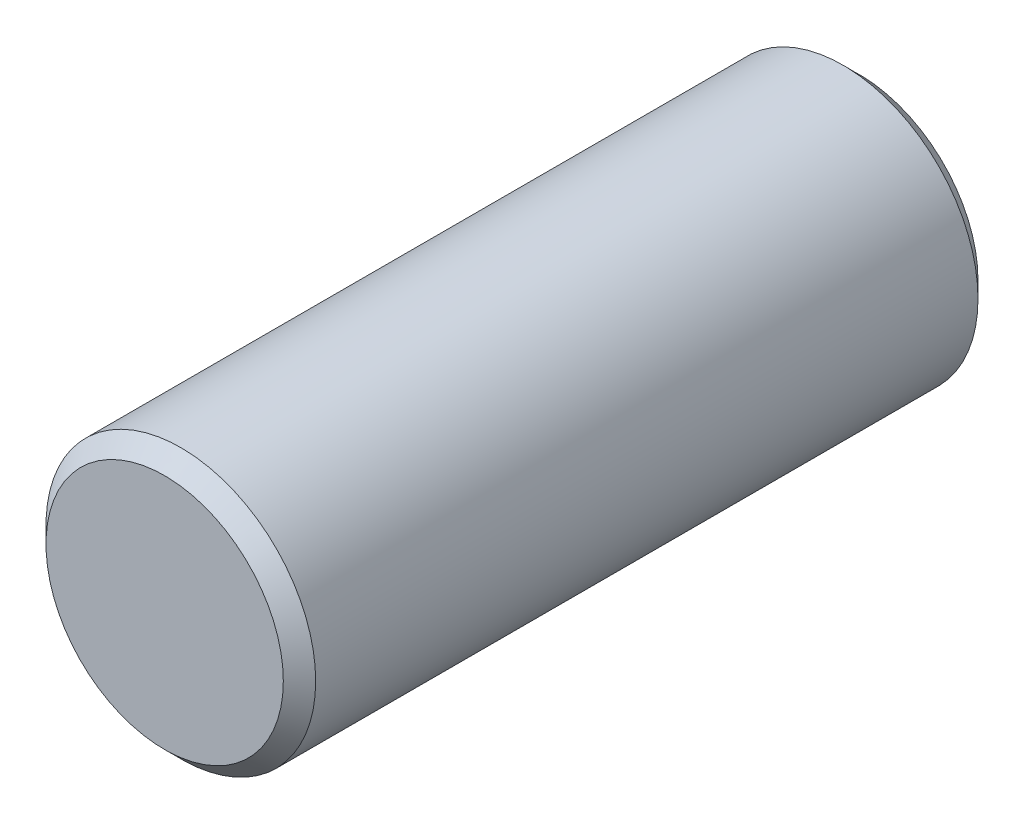
ISO-10303-21;
HEADER;
FILE_DESCRIPTION(('STEP AP214'),'2;1');
FILE_NAME('part.step','',(''),(''),'','','');
FILE_SCHEMA(('AUTOMOTIVE_DESIGN { 1 0 10303 214 1 1 1 1 }'));
ENDSEC;
DATA;
#1=APPLICATION_CONTEXT('core data for automotive mechanical design processes');
#2=APPLICATION_PROTOCOL_DEFINITION('international standard','automotive_design',2000,#1);
#3=PRODUCT_CONTEXT('',#1,'mechanical');
#4=PRODUCT('Part','Part','',(#3));
#5=PRODUCT_RELATED_PRODUCT_CATEGORY('part','',(#4));
#6=PRODUCT_DEFINITION_FORMATION('','',#4);
#7=PRODUCT_DEFINITION_CONTEXT('part definition',#1,'design');
#8=PRODUCT_DEFINITION('design','',#6,#7);
#9=PRODUCT_DEFINITION_SHAPE('','',#8);
#10=(LENGTH_UNIT() NAMED_UNIT(*) SI_UNIT(.MILLI.,.METRE.));
#11=(NAMED_UNIT(*) PLANE_ANGLE_UNIT() SI_UNIT($,.RADIAN.));
#12=(NAMED_UNIT(*) SI_UNIT($,.STERADIAN.) SOLID_ANGLE_UNIT());
#13=UNCERTAINTY_MEASURE_WITH_UNIT(LENGTH_MEASURE(1.E-05),#10,'distance_accuracy_value','');
#14=(GEOMETRIC_REPRESENTATION_CONTEXT(3) GLOBAL_UNCERTAINTY_ASSIGNED_CONTEXT((#13)) GLOBAL_UNIT_ASSIGNED_CONTEXT((#10,
#11,#12)) REPRESENTATION_CONTEXT('',''));
#15=CARTESIAN_POINT('',(0.,0.,0.));
#16=DIRECTION('',(0.,0.,1.));
#17=DIRECTION('',(1.,0.,0.));
#18=AXIS2_PLACEMENT_3D('',#15,#16,#17);
#19=CARTESIAN_POINT('',(0.,0.,8.1788));
#20=DIRECTION('',(0.,0.,-1.));
#21=DIRECTION('',(-1.,0.,0.));
#22=AXIS2_PLACEMENT_3D('',#19,#20,#21);
#23=CYLINDRICAL_SURFACE('',#22,3.175);
#24=CARTESIAN_POINT('',(0.,0.,-7.7978));
#25=DIRECTION('',(0.,0.,1.));
#26=DIRECTION('',(1.,0.,0.));
#27=AXIS2_PLACEMENT_3D('',#24,#25,#26);
#28=CIRCLE('',#27,3.175);
#29=CARTESIAN_POINT('',(3.175,0.,-7.7978));
#30=VERTEX_POINT('',#29);
#31=EDGE_CURVE('E40',#30,#30,#28,.T.);
#32=ORIENTED_EDGE('',*,*,#31,.T.);
#33=EDGE_LOOP('',(#32));
#34=FACE_BOUND('',#33,.T.);
#35=CARTESIAN_POINT('',(0.,0.,7.79779999999999));
#36=DIRECTION('',(0.,0.,1.));
#37=DIRECTION('',(1.,0.,0.));
#38=AXIS2_PLACEMENT_3D('',#35,#36,#37);
#39=CIRCLE('',#38,3.175);
#40=CARTESIAN_POINT('',(3.175,0.,7.79779999999999));
#41=VERTEX_POINT('',#40);
#42=EDGE_CURVE('E44',#41,#41,#39,.F.);
#43=ORIENTED_EDGE('',*,*,#42,.T.);
#44=EDGE_LOOP('',(#43));
#45=FACE_BOUND('',#44,.T.);
#46=ADVANCED_FACE('F30',(#34,#45),#23,.T.);
#47=CARTESIAN_POINT('',(0.,0.,8.1788));
#48=DIRECTION('',(0.,0.,1.));
#49=DIRECTION('',(1.,0.,0.));
#50=AXIS2_PLACEMENT_3D('',#47,#48,#49);
#51=PLANE('',#50);
#52=CARTESIAN_POINT('',(0.,0.,8.1788));
#53=DIRECTION('',(0.,0.,1.));
#54=DIRECTION('',(1.,0.,0.));
#55=AXIS2_PLACEMENT_3D('',#52,#53,#54);
#56=CIRCLE('',#55,2.79399999999999);
#57=CARTESIAN_POINT('',(2.79399999999999,0.,8.1788));
#58=VERTEX_POINT('',#57);
#59=EDGE_CURVE('E10',#58,#58,#56,.T.);
#60=ORIENTED_EDGE('',*,*,#59,.T.);
#61=EDGE_LOOP('',(#60));
#62=FACE_BOUND('',#61,.T.);
#63=ADVANCED_FACE('F63',(#62),#51,.T.);
#64=CARTESIAN_POINT('',(0.,0.,-8.1788));
#65=DIRECTION('',(0.,0.,1.));
#66=DIRECTION('',(1.,0.,0.));
#67=AXIS2_PLACEMENT_3D('',#64,#65,#66);
#68=PLANE('',#67);
#69=CARTESIAN_POINT('',(0.,0.,-8.1788));
#70=DIRECTION('',(0.,0.,1.));
#71=DIRECTION('',(1.,0.,0.));
#72=AXIS2_PLACEMENT_3D('',#69,#70,#71);
#73=CIRCLE('',#72,2.794);
#74=CARTESIAN_POINT('',(2.794,0.,-8.1788));
#75=VERTEX_POINT('',#74);
#76=EDGE_CURVE('E36',#75,#75,#73,.F.);
#77=ORIENTED_EDGE('',*,*,#76,.T.);
#78=EDGE_LOOP('',(#77));
#79=FACE_BOUND('',#78,.T.);
#80=ADVANCED_FACE('F59',(#79),#68,.F.);
#81=CARTESIAN_POINT('',(0.,0.,-7.7978));
#82=DIRECTION('',(0.,0.,1.));
#83=DIRECTION('',(1.,0.,0.));
#84=AXIS2_PLACEMENT_3D('',#81,#82,#83);
#85=CONICAL_SURFACE('',#84,3.175,0.78539816339745);
#86=ORIENTED_EDGE('',*,*,#76,.F.);
#87=EDGE_LOOP('',(#86));
#88=FACE_BOUND('',#87,.T.);
#89=ORIENTED_EDGE('',*,*,#31,.F.);
#90=EDGE_LOOP('',(#89));
#91=FACE_BOUND('',#90,.T.);
#92=ADVANCED_FACE('F54',(#88,#91),#85,.T.);
#93=CARTESIAN_POINT('',(0.,0.,8.1788));
#94=DIRECTION('',(0.,0.,-1.));
#95=DIRECTION('',(-1.,0.,0.));
#96=AXIS2_PLACEMENT_3D('',#93,#94,#95);
#97=CONICAL_SURFACE('',#96,2.79399999999999,0.785398163397448);
#98=ORIENTED_EDGE('',*,*,#42,.F.);
#99=EDGE_LOOP('',(#98));
#100=FACE_BOUND('',#99,.T.);
#101=ORIENTED_EDGE('',*,*,#59,.F.);
#102=EDGE_LOOP('',(#101));
#103=FACE_BOUND('',#102,.T.);
#104=ADVANCED_FACE('F51',(#100,#103),#97,.T.);
#105=CLOSED_SHELL('',(#46,#63,#80,#92,#104));
#106=MANIFOLD_SOLID_BREP('B2',#105);
#107=ADVANCED_BREP_SHAPE_REPRESENTATION('',(#18,#106),#14);
#108=SHAPE_DEFINITION_REPRESENTATION(#9,#107);
ENDSEC;
END-ISO-10303-21;
